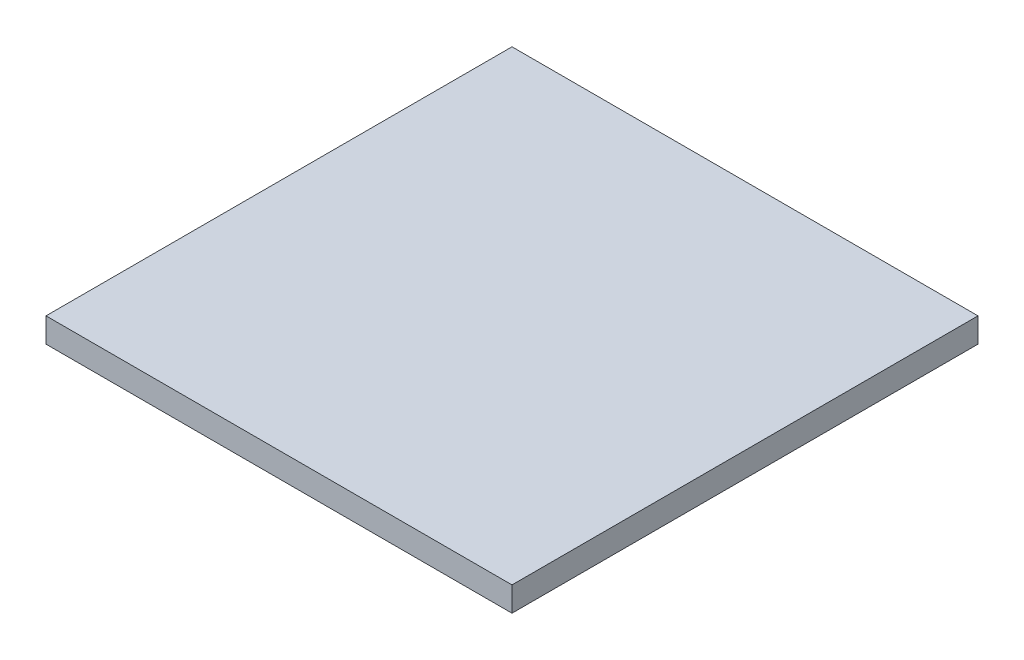
ISO-10303-21;
HEADER;
FILE_DESCRIPTION(('STEP AP214'),'2;1');
FILE_NAME('part.step','',(''),(''),'','','');
FILE_SCHEMA(('AUTOMOTIVE_DESIGN { 1 0 10303 214 1 1 1 1 }'));
ENDSEC;
DATA;
#1=APPLICATION_CONTEXT('core data for automotive mechanical design processes');
#2=APPLICATION_PROTOCOL_DEFINITION('international standard','automotive_design',2000,#1);
#3=PRODUCT_CONTEXT('',#1,'mechanical');
#4=PRODUCT('Part','Part','',(#3));
#5=PRODUCT_RELATED_PRODUCT_CATEGORY('part','',(#4));
#6=PRODUCT_DEFINITION_FORMATION('','',#4);
#7=PRODUCT_DEFINITION_CONTEXT('part definition',#1,'design');
#8=PRODUCT_DEFINITION('design','',#6,#7);
#9=PRODUCT_DEFINITION_SHAPE('','',#8);
#10=(LENGTH_UNIT() NAMED_UNIT(*) SI_UNIT(.MILLI.,.METRE.));
#11=(NAMED_UNIT(*) PLANE_ANGLE_UNIT() SI_UNIT($,.RADIAN.));
#12=(NAMED_UNIT(*) SI_UNIT($,.STERADIAN.) SOLID_ANGLE_UNIT());
#13=UNCERTAINTY_MEASURE_WITH_UNIT(LENGTH_MEASURE(1.E-05),#10,'distance_accuracy_value','');
#14=(GEOMETRIC_REPRESENTATION_CONTEXT(3) GLOBAL_UNCERTAINTY_ASSIGNED_CONTEXT((#13)) GLOBAL_UNIT_ASSIGNED_CONTEXT((#10,
#11,#12)) REPRESENTATION_CONTEXT('',''));
#15=CARTESIAN_POINT('',(0.,0.,0.));
#16=DIRECTION('',(0.,0.,1.));
#17=DIRECTION('',(1.,0.,0.));
#18=AXIS2_PLACEMENT_3D('',#15,#16,#17);
#19=CARTESIAN_POINT('',(0.,5.,0.));
#20=DIRECTION('',(1.,0.,0.));
#21=DIRECTION('',(0.,0.,-1.));
#22=AXIS2_PLACEMENT_3D('',#19,#20,#21);
#23=PLANE('',#22);
#24=DIRECTION('',(0.,0.,1.));
#25=VECTOR('',#24,1.);
#26=CARTESIAN_POINT('',(0.,0.,0.));
#27=LINE('',#26,#25);
#28=CARTESIAN_POINT('',(0.,0.,-95.));
#29=VERTEX_POINT('',#28);
#30=CARTESIAN_POINT('',(0.,0.,0.));
#31=VERTEX_POINT('',#30);
#32=EDGE_CURVE('E96',#29,#31,#27,.T.);
#33=ORIENTED_EDGE('',*,*,#32,.T.);
#34=DIRECTION('',(0.,-1.,0.));
#35=VECTOR('',#34,1.);
#36=CARTESIAN_POINT('',(0.,5.,0.));
#37=LINE('',#36,#35);
#38=CARTESIAN_POINT('',(0.,5.,0.));
#39=VERTEX_POINT('',#38);
#40=EDGE_CURVE('E11',#39,#31,#37,.T.);
#41=ORIENTED_EDGE('',*,*,#40,.F.);
#42=DIRECTION('',(0.,0.,1.));
#43=VECTOR('',#42,1.);
#44=CARTESIAN_POINT('',(0.,5.,0.));
#45=LINE('',#44,#43);
#46=CARTESIAN_POINT('',(0.,5.,-95.));
#47=VERTEX_POINT('',#46);
#48=EDGE_CURVE('E84',#47,#39,#45,.T.);
#49=ORIENTED_EDGE('',*,*,#48,.F.);
#50=DIRECTION('',(0.,-1.,0.));
#51=VECTOR('',#50,1.);
#52=CARTESIAN_POINT('',(0.,5.,-95.));
#53=LINE('',#52,#51);
#54=EDGE_CURVE('E92',#47,#29,#53,.T.);
#55=ORIENTED_EDGE('',*,*,#54,.T.);
#56=EDGE_LOOP('',(#33,#41,#49,#55));
#57=FACE_BOUND('',#56,.T.);
#58=ADVANCED_FACE('F33',(#57),#23,.F.);
#59=CARTESIAN_POINT('',(0.,5.,0.));
#60=DIRECTION('',(0.,0.,-1.));
#61=DIRECTION('',(-1.,0.,0.));
#62=AXIS2_PLACEMENT_3D('',#59,#60,#61);
#63=PLANE('',#62);
#64=DIRECTION('',(1.,0.,0.));
#65=VECTOR('',#64,1.);
#66=CARTESIAN_POINT('',(0.,0.,0.));
#67=LINE('',#66,#65);
#68=CARTESIAN_POINT('',(95.,0.,0.));
#69=VERTEX_POINT('',#68);
#70=EDGE_CURVE('E88',#31,#69,#67,.T.);
#71=ORIENTED_EDGE('',*,*,#70,.T.);
#72=DIRECTION('',(0.,-1.,0.));
#73=VECTOR('',#72,1.);
#74=CARTESIAN_POINT('',(95.,5.,0.));
#75=LINE('',#74,#73);
#76=CARTESIAN_POINT('',(95.,5.,0.));
#77=VERTEX_POINT('',#76);
#78=EDGE_CURVE('E41',#77,#69,#75,.T.);
#79=ORIENTED_EDGE('',*,*,#78,.F.);
#80=DIRECTION('',(1.,0.,0.));
#81=VECTOR('',#80,1.);
#82=CARTESIAN_POINT('',(0.,5.,0.));
#83=LINE('',#82,#81);
#84=EDGE_CURVE('E79',#39,#77,#83,.T.);
#85=ORIENTED_EDGE('',*,*,#84,.F.);
#86=ORIENTED_EDGE('',*,*,#40,.T.);
#87=EDGE_LOOP('',(#71,#79,#85,#86));
#88=FACE_BOUND('',#87,.T.);
#89=ADVANCED_FACE('F87',(#88),#63,.F.);
#90=CARTESIAN_POINT('',(95.,5.,0.));
#91=DIRECTION('',(-1.,0.,0.));
#92=DIRECTION('',(0.,0.,1.));
#93=AXIS2_PLACEMENT_3D('',#90,#91,#92);
#94=PLANE('',#93);
#95=DIRECTION('',(0.,0.,-1.));
#96=VECTOR('',#95,1.);
#97=CARTESIAN_POINT('',(95.,0.,0.));
#98=LINE('',#97,#96);
#99=CARTESIAN_POINT('',(95.,0.,-95.));
#100=VERTEX_POINT('',#99);
#101=EDGE_CURVE('E66',#69,#100,#98,.T.);
#102=ORIENTED_EDGE('',*,*,#101,.T.);
#103=DIRECTION('',(0.,-1.,0.));
#104=VECTOR('',#103,1.);
#105=CARTESIAN_POINT('',(95.,5.,-95.));
#106=LINE('',#105,#104);
#107=CARTESIAN_POINT('',(95.,5.,-95.));
#108=VERTEX_POINT('',#107);
#109=EDGE_CURVE('E89',#108,#100,#106,.T.);
#110=ORIENTED_EDGE('',*,*,#109,.F.);
#111=DIRECTION('',(0.,0.,-1.));
#112=VECTOR('',#111,1.);
#113=CARTESIAN_POINT('',(95.,5.,0.));
#114=LINE('',#113,#112);
#115=EDGE_CURVE('E82',#77,#108,#114,.T.);
#116=ORIENTED_EDGE('',*,*,#115,.F.);
#117=ORIENTED_EDGE('',*,*,#78,.T.);
#118=EDGE_LOOP('',(#102,#110,#116,#117));
#119=FACE_BOUND('',#118,.T.);
#120=ADVANCED_FACE('F90',(#119),#94,.F.);
#121=CARTESIAN_POINT('',(0.,5.,-95.));
#122=DIRECTION('',(0.,0.,1.));
#123=DIRECTION('',(1.,0.,0.));
#124=AXIS2_PLACEMENT_3D('',#121,#122,#123);
#125=PLANE('',#124);
#126=DIRECTION('',(-1.,0.,0.));
#127=VECTOR('',#126,1.);
#128=CARTESIAN_POINT('',(0.,0.,-95.));
#129=LINE('',#128,#127);
#130=EDGE_CURVE('E72',#100,#29,#129,.T.);
#131=ORIENTED_EDGE('',*,*,#130,.T.);
#132=ORIENTED_EDGE('',*,*,#54,.F.);
#133=DIRECTION('',(-1.,0.,0.));
#134=VECTOR('',#133,1.);
#135=CARTESIAN_POINT('',(0.,5.,-95.));
#136=LINE('',#135,#134);
#137=EDGE_CURVE('E49',#108,#47,#136,.T.);
#138=ORIENTED_EDGE('',*,*,#137,.F.);
#139=ORIENTED_EDGE('',*,*,#109,.T.);
#140=EDGE_LOOP('',(#131,#132,#138,#139));
#141=FACE_BOUND('',#140,.T.);
#142=ADVANCED_FACE('F103',(#141),#125,.F.);
#143=CARTESIAN_POINT('',(0.,5.,0.));
#144=DIRECTION('',(0.,-1.,0.));
#145=DIRECTION('',(0.,0.,-1.));
#146=AXIS2_PLACEMENT_3D('',#143,#144,#145);
#147=PLANE('',#146);
#148=ORIENTED_EDGE('',*,*,#48,.T.);
#149=ORIENTED_EDGE('',*,*,#84,.T.);
#150=ORIENTED_EDGE('',*,*,#115,.T.);
#151=ORIENTED_EDGE('',*,*,#137,.T.);
#152=EDGE_LOOP('',(#148,#149,#150,#151));
#153=FACE_BOUND('',#152,.T.);
#154=ADVANCED_FACE('F80',(#153),#147,.F.);
#155=CARTESIAN_POINT('',(0.,0.,0.));
#156=DIRECTION('',(0.,-1.,0.));
#157=DIRECTION('',(0.,0.,-1.));
#158=AXIS2_PLACEMENT_3D('',#155,#156,#157);
#159=PLANE('',#158);
#160=ORIENTED_EDGE('',*,*,#32,.F.);
#161=ORIENTED_EDGE('',*,*,#130,.F.);
#162=ORIENTED_EDGE('',*,*,#101,.F.);
#163=ORIENTED_EDGE('',*,*,#70,.F.);
#164=EDGE_LOOP('',(#160,#161,#162,#163));
#165=FACE_BOUND('',#164,.T.);
#166=ADVANCED_FACE('F106',(#165),#159,.T.);
#167=CLOSED_SHELL('',(#58,#89,#120,#142,#154,#166));
#168=MANIFOLD_SOLID_BREP('B2',#167);
#169=ADVANCED_BREP_SHAPE_REPRESENTATION('',(#18,#168),#14);
#170=SHAPE_DEFINITION_REPRESENTATION(#9,#169);
ENDSEC;
END-ISO-10303-21;
